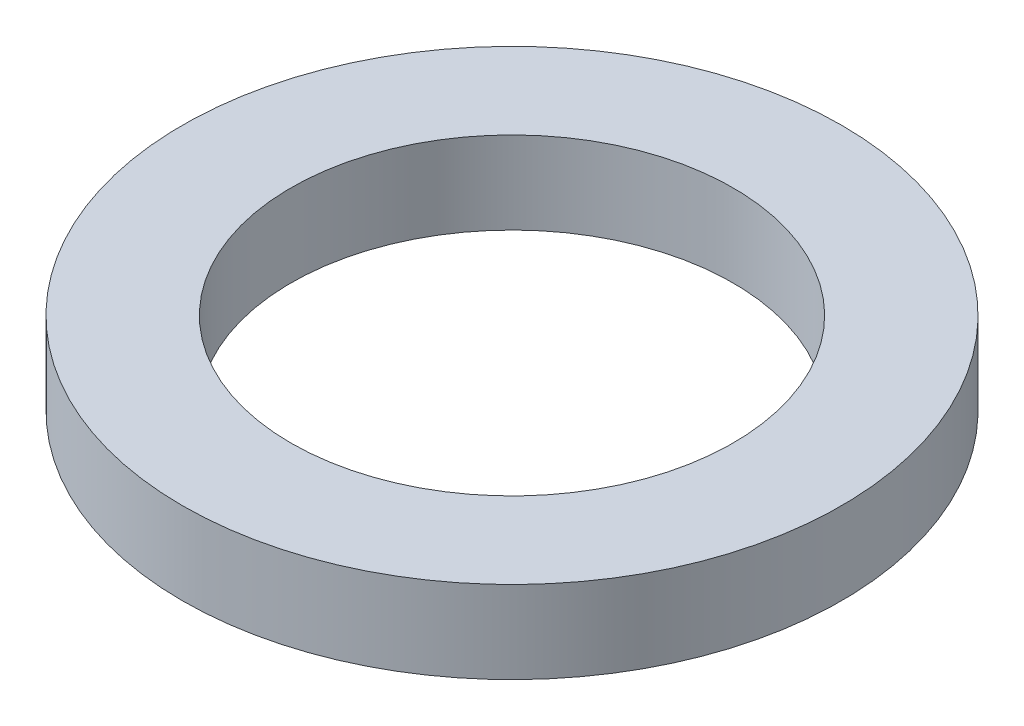
ISO-10303-21;
HEADER;
FILE_DESCRIPTION(('STEP AP214'),'2;1');
FILE_NAME('part.step','',(''),(''),'','','');
FILE_SCHEMA(('AUTOMOTIVE_DESIGN { 1 0 10303 214 1 1 1 1 }'));
ENDSEC;
DATA;
#1=APPLICATION_CONTEXT('core data for automotive mechanical design processes');
#2=APPLICATION_PROTOCOL_DEFINITION('international standard','automotive_design',2000,#1);
#3=PRODUCT_CONTEXT('',#1,'mechanical');
#4=PRODUCT('Part','Part','',(#3));
#5=PRODUCT_RELATED_PRODUCT_CATEGORY('part','',(#4));
#6=PRODUCT_DEFINITION_FORMATION('','',#4);
#7=PRODUCT_DEFINITION_CONTEXT('part definition',#1,'design');
#8=PRODUCT_DEFINITION('design','',#6,#7);
#9=PRODUCT_DEFINITION_SHAPE('','',#8);
#10=(LENGTH_UNIT() NAMED_UNIT(*) SI_UNIT(.MILLI.,.METRE.));
#11=(NAMED_UNIT(*) PLANE_ANGLE_UNIT() SI_UNIT($,.RADIAN.));
#12=(NAMED_UNIT(*) SI_UNIT($,.STERADIAN.) SOLID_ANGLE_UNIT());
#13=UNCERTAINTY_MEASURE_WITH_UNIT(LENGTH_MEASURE(1.E-05),#10,'distance_accuracy_value','');
#14=(GEOMETRIC_REPRESENTATION_CONTEXT(3) GLOBAL_UNCERTAINTY_ASSIGNED_CONTEXT((#13)) GLOBAL_UNIT_ASSIGNED_CONTEXT((#10,
#11,#12)) REPRESENTATION_CONTEXT('',''));
#15=CARTESIAN_POINT('',(0.,0.,0.));
#16=DIRECTION('',(0.,0.,1.));
#17=DIRECTION('',(1.,0.,0.));
#18=AXIS2_PLACEMENT_3D('',#15,#16,#17);
#19=CARTESIAN_POINT('',(0.,0.,0.));
#20=DIRECTION('',(0.,1.,0.));
#21=DIRECTION('',(0.,0.,1.));
#22=AXIS2_PLACEMENT_3D('',#19,#20,#21);
#23=CYLINDRICAL_SURFACE('',#22,4.025);
#24=CARTESIAN_POINT('',(0.,1.5,0.));
#25=DIRECTION('',(0.,1.,0.));
#26=DIRECTION('',(0.,0.,1.));
#27=AXIS2_PLACEMENT_3D('',#24,#25,#26);
#28=CIRCLE('',#27,4.025);
#29=CARTESIAN_POINT('',(0.,1.5,4.025));
#30=VERTEX_POINT('',#29);
#31=EDGE_CURVE('E10',#30,#30,#28,.T.);
#32=ORIENTED_EDGE('',*,*,#31,.T.);
#33=EDGE_LOOP('',(#32));
#34=FACE_BOUND('',#33,.T.);
#35=CARTESIAN_POINT('',(0.,0.,0.));
#36=DIRECTION('',(0.,1.,0.));
#37=DIRECTION('',(0.,0.,1.));
#38=AXIS2_PLACEMENT_3D('',#35,#36,#37);
#39=CIRCLE('',#38,4.025);
#40=CARTESIAN_POINT('',(0.,0.,4.025));
#41=VERTEX_POINT('',#40);
#42=EDGE_CURVE('E47',#41,#41,#39,.T.);
#43=ORIENTED_EDGE('',*,*,#42,.F.);
#44=EDGE_LOOP('',(#43));
#45=FACE_BOUND('',#44,.T.);
#46=ADVANCED_FACE('F33',(#34,#45),#23,.F.);
#47=CARTESIAN_POINT('',(4.025,1.5,0.));
#48=DIRECTION('',(0.,1.,0.));
#49=DIRECTION('',(0.,0.,1.));
#50=AXIS2_PLACEMENT_3D('',#47,#48,#49);
#51=PLANE('',#50);
#52=CARTESIAN_POINT('',(0.,1.5,0.));
#53=DIRECTION('',(0.,1.,0.));
#54=DIRECTION('',(0.,0.,1.));
#55=AXIS2_PLACEMENT_3D('',#52,#53,#54);
#56=CIRCLE('',#55,6.);
#57=CARTESIAN_POINT('',(0.,1.5,6.));
#58=VERTEX_POINT('',#57);
#59=EDGE_CURVE('E39',#58,#58,#56,.T.);
#60=ORIENTED_EDGE('',*,*,#59,.T.);
#61=EDGE_LOOP('',(#60));
#62=FACE_BOUND('',#61,.T.);
#63=ORIENTED_EDGE('',*,*,#31,.F.);
#64=EDGE_LOOP('',(#63));
#65=FACE_BOUND('',#64,.T.);
#66=ADVANCED_FACE('F57',(#62,#65),#51,.T.);
#67=CARTESIAN_POINT('',(0.,0.,0.));
#68=DIRECTION('',(0.,1.,0.));
#69=DIRECTION('',(0.,0.,1.));
#70=AXIS2_PLACEMENT_3D('',#67,#68,#69);
#71=CYLINDRICAL_SURFACE('',#70,6.);
#72=CARTESIAN_POINT('',(0.,0.,0.));
#73=DIRECTION('',(0.,1.,0.));
#74=DIRECTION('',(0.,0.,1.));
#75=AXIS2_PLACEMENT_3D('',#72,#73,#74);
#76=CIRCLE('',#75,6.);
#77=CARTESIAN_POINT('',(0.,0.,6.));
#78=VERTEX_POINT('',#77);
#79=EDGE_CURVE('E43',#78,#78,#76,.T.);
#80=ORIENTED_EDGE('',*,*,#79,.T.);
#81=EDGE_LOOP('',(#80));
#82=FACE_BOUND('',#81,.T.);
#83=ORIENTED_EDGE('',*,*,#59,.F.);
#84=EDGE_LOOP('',(#83));
#85=FACE_BOUND('',#84,.T.);
#86=ADVANCED_FACE('F61',(#82,#85),#71,.T.);
#87=CARTESIAN_POINT('',(6.,0.,0.));
#88=DIRECTION('',(0.,-1.,0.));
#89=DIRECTION('',(0.,0.,-1.));
#90=AXIS2_PLACEMENT_3D('',#87,#88,#89);
#91=PLANE('',#90);
#92=ORIENTED_EDGE('',*,*,#42,.T.);
#93=EDGE_LOOP('',(#92));
#94=FACE_BOUND('',#93,.T.);
#95=ORIENTED_EDGE('',*,*,#79,.F.);
#96=EDGE_LOOP('',(#95));
#97=FACE_BOUND('',#96,.T.);
#98=ADVANCED_FACE('F53',(#94,#97),#91,.T.);
#99=CLOSED_SHELL('',(#46,#66,#86,#98));
#100=MANIFOLD_SOLID_BREP('B2',#99);
#101=ADVANCED_BREP_SHAPE_REPRESENTATION('',(#18,#100),#14);
#102=SHAPE_DEFINITION_REPRESENTATION(#9,#101);
ENDSEC;
END-ISO-10303-21;
